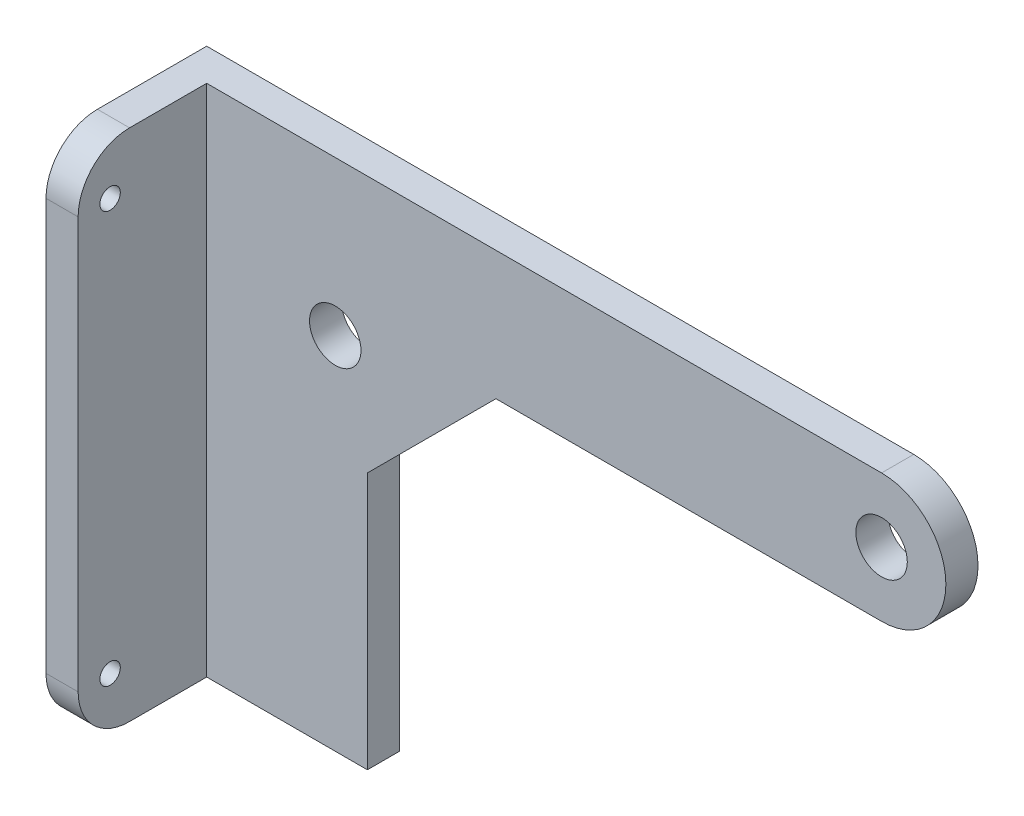
ISO-10303-21;
HEADER;
FILE_DESCRIPTION(('STEP AP214'),'2;1');
FILE_NAME('part.step','',(''),(''),'','','');
FILE_SCHEMA(('AUTOMOTIVE_DESIGN { 1 0 10303 214 1 1 1 1 }'));
ENDSEC;
DATA;
#1=APPLICATION_CONTEXT('core data for automotive mechanical design processes');
#2=APPLICATION_PROTOCOL_DEFINITION('international standard','automotive_design',2000,#1);
#3=PRODUCT_CONTEXT('',#1,'mechanical');
#4=PRODUCT('Part','Part','',(#3));
#5=PRODUCT_RELATED_PRODUCT_CATEGORY('part','',(#4));
#6=PRODUCT_DEFINITION_FORMATION('','',#4);
#7=PRODUCT_DEFINITION_CONTEXT('part definition',#1,'design');
#8=PRODUCT_DEFINITION('design','',#6,#7);
#9=PRODUCT_DEFINITION_SHAPE('','',#8);
#10=(LENGTH_UNIT() NAMED_UNIT(*) SI_UNIT(.MILLI.,.METRE.));
#11=(NAMED_UNIT(*) PLANE_ANGLE_UNIT() SI_UNIT($,.RADIAN.));
#12=(NAMED_UNIT(*) SI_UNIT($,.STERADIAN.) SOLID_ANGLE_UNIT());
#13=UNCERTAINTY_MEASURE_WITH_UNIT(LENGTH_MEASURE(1.E-05),#10,'distance_accuracy_value','');
#14=(GEOMETRIC_REPRESENTATION_CONTEXT(3) GLOBAL_UNCERTAINTY_ASSIGNED_CONTEXT((#13)) GLOBAL_UNIT_ASSIGNED_CONTEXT((#10,
#11,#12)) REPRESENTATION_CONTEXT('',''));
#15=CARTESIAN_POINT('',(0.,0.,0.));
#16=DIRECTION('',(0.,0.,1.));
#17=DIRECTION('',(1.,0.,0.));
#18=AXIS2_PLACEMENT_3D('',#15,#16,#17);
#19=CARTESIAN_POINT('',(405.,0.,12.5));
#20=DIRECTION('',(0.,0.,-1.));
#21=DIRECTION('',(-1.,0.,0.));
#22=AXIS2_PLACEMENT_3D('',#19,#20,#21);
#23=PLANE('',#22);
#24=CARTESIAN_POINT('',(-20.,-70.,12.5));
#25=DIRECTION('',(0.,0.,1.));
#26=DIRECTION('',(1.,0.,0.));
#27=AXIS2_PLACEMENT_3D('',#24,#25,#26);
#28=CIRCLE('',#27,20.);
#29=CARTESIAN_POINT('',(0.,-70.,12.5));
#30=VERTEX_POINT('',#29);
#31=EDGE_CURVE('E155',#30,#30,#28,.T.);
#32=ORIENTED_EDGE('',*,*,#31,.F.);
#33=EDGE_LOOP('',(#32));
#34=FACE_BOUND('',#33,.T.);
#35=CARTESIAN_POINT('',(405.,0.,12.5));
#36=DIRECTION('',(0.,0.,1.));
#37=DIRECTION('',(1.,0.,0.));
#38=AXIS2_PLACEMENT_3D('',#35,#36,#37);
#39=CIRCLE('',#38,20.);
#40=CARTESIAN_POINT('',(425.,0.,12.5));
#41=VERTEX_POINT('',#40);
#42=EDGE_CURVE('E161',#41,#41,#39,.T.);
#43=ORIENTED_EDGE('',*,*,#42,.F.);
#44=EDGE_LOOP('',(#43));
#45=FACE_BOUND('',#44,.T.);
#46=DIRECTION('',(0.,1.,0.));
#47=VECTOR('',#46,1.);
#48=CARTESIAN_POINT('',(-120.,-350.,12.5));
#49=LINE('',#48,#47);
#50=CARTESIAN_POINT('',(-120.,-350.,12.5));
#51=VERTEX_POINT('',#50);
#52=CARTESIAN_POINT('',(-120.,50.,12.5));
#53=VERTEX_POINT('',#52);
#54=EDGE_CURVE('E134',#51,#53,#49,.T.);
#55=ORIENTED_EDGE('',*,*,#54,.F.);
#56=DIRECTION('',(1.,0.,0.));
#57=VECTOR('',#56,1.);
#58=CARTESIAN_POINT('',(5.00000000000006,-350.,12.5));
#59=LINE('',#58,#57);
#60=CARTESIAN_POINT('',(5.00000000000006,-350.,12.5));
#61=VERTEX_POINT('',#60);
#62=EDGE_CURVE('E139',#51,#61,#59,.T.);
#63=ORIENTED_EDGE('',*,*,#62,.T.);
#64=DIRECTION('',(0.,1.,0.));
#65=VECTOR('',#64,1.);
#66=CARTESIAN_POINT('',(5.00000000000006,-150.,12.5));
#67=LINE('',#66,#65);
#68=CARTESIAN_POINT('',(5.00000000000006,-150.,12.5));
#69=VERTEX_POINT('',#68);
#70=EDGE_CURVE('E170',#61,#69,#67,.T.);
#71=ORIENTED_EDGE('',*,*,#70,.T.);
#72=DIRECTION('',(0.707106781186544,0.707106781186552,0.));
#73=VECTOR('',#72,1.);
#74=CARTESIAN_POINT('',(104.999999999999,-50.0000000000001,12.5));
#75=LINE('',#74,#73);
#76=CARTESIAN_POINT('',(104.999999999999,-50.0000000000001,12.5));
#77=VERTEX_POINT('',#76);
#78=EDGE_CURVE('E172',#69,#77,#75,.T.);
#79=ORIENTED_EDGE('',*,*,#78,.T.);
#80=DIRECTION('',(1.,0.,0.));
#81=VECTOR('',#80,1.);
#82=CARTESIAN_POINT('',(405.,-50.,12.5));
#83=LINE('',#82,#81);
#84=CARTESIAN_POINT('',(405.,-50.,12.5));
#85=VERTEX_POINT('',#84);
#86=EDGE_CURVE('E174',#77,#85,#83,.T.);
#87=ORIENTED_EDGE('',*,*,#86,.T.);
#88=CARTESIAN_POINT('',(405.,0.,12.5));
#89=DIRECTION('',(0.,0.,1.));
#90=DIRECTION('',(-1.,0.,0.));
#91=AXIS2_PLACEMENT_3D('',#88,#89,#90);
#92=CIRCLE('',#91,50.);
#93=CARTESIAN_POINT('',(405.,50.,12.5));
#94=VERTEX_POINT('',#93);
#95=EDGE_CURVE('E137',#85,#94,#92,.T.);
#96=ORIENTED_EDGE('',*,*,#95,.T.);
#97=DIRECTION('',(-1.,0.,0.));
#98=VECTOR('',#97,1.);
#99=CARTESIAN_POINT('',(-145.,50.,12.5));
#100=LINE('',#99,#98);
#101=EDGE_CURVE('E123',#94,#53,#100,.T.);
#102=ORIENTED_EDGE('',*,*,#101,.T.);
#103=EDGE_LOOP('',(#55,#63,#71,#79,#87,#96,#102));
#104=FACE_BOUND('',#103,.T.);
#105=ADVANCED_FACE('F37',(#34,#45,#104),#23,.F.);
#106=CARTESIAN_POINT('',(405.,0.,-12.5));
#107=DIRECTION('',(0.,0.,-1.));
#108=DIRECTION('',(-1.,0.,0.));
#109=AXIS2_PLACEMENT_3D('',#106,#107,#108);
#110=PLANE('',#109);
#111=CARTESIAN_POINT('',(405.,0.,-12.5));
#112=DIRECTION('',(0.,0.,1.));
#113=DIRECTION('',(1.,0.,0.));
#114=AXIS2_PLACEMENT_3D('',#111,#112,#113);
#115=CIRCLE('',#114,20.);
#116=CARTESIAN_POINT('',(425.,0.,-12.5));
#117=VERTEX_POINT('',#116);
#118=EDGE_CURVE('E158',#117,#117,#115,.T.);
#119=ORIENTED_EDGE('',*,*,#118,.T.);
#120=EDGE_LOOP('',(#119));
#121=FACE_BOUND('',#120,.T.);
#122=CARTESIAN_POINT('',(405.,0.,-12.5));
#123=DIRECTION('',(0.,0.,1.));
#124=DIRECTION('',(-1.,0.,0.));
#125=AXIS2_PLACEMENT_3D('',#122,#123,#124);
#126=CIRCLE('',#125,50.);
#127=CARTESIAN_POINT('',(405.,-50.,-12.5));
#128=VERTEX_POINT('',#127);
#129=CARTESIAN_POINT('',(405.,50.,-12.5));
#130=VERTEX_POINT('',#129);
#131=EDGE_CURVE('E164',#128,#130,#126,.T.);
#132=ORIENTED_EDGE('',*,*,#131,.F.);
#133=DIRECTION('',(1.,0.,0.));
#134=VECTOR('',#133,1.);
#135=CARTESIAN_POINT('',(405.,-50.,-12.5));
#136=LINE('',#135,#134);
#137=CARTESIAN_POINT('',(104.999999999999,-50.0000000000001,-12.5));
#138=VERTEX_POINT('',#137);
#139=EDGE_CURVE('E167',#138,#128,#136,.T.);
#140=ORIENTED_EDGE('',*,*,#139,.F.);
#141=DIRECTION('',(0.707106781186544,0.707106781186552,0.));
#142=VECTOR('',#141,1.);
#143=CARTESIAN_POINT('',(104.999999999999,-50.0000000000001,-12.5));
#144=LINE('',#143,#142);
#145=CARTESIAN_POINT('',(5.00000000000006,-150.,-12.5));
#146=VERTEX_POINT('',#145);
#147=EDGE_CURVE('E189',#146,#138,#144,.T.);
#148=ORIENTED_EDGE('',*,*,#147,.F.);
#149=DIRECTION('',(0.,1.,0.));
#150=VECTOR('',#149,1.);
#151=CARTESIAN_POINT('',(5.00000000000006,-150.,-12.5));
#152=LINE('',#151,#150);
#153=CARTESIAN_POINT('',(5.00000000000006,-350.,-12.5));
#154=VERTEX_POINT('',#153);
#155=EDGE_CURVE('E187',#154,#146,#152,.T.);
#156=ORIENTED_EDGE('',*,*,#155,.F.);
#157=DIRECTION('',(1.,0.,0.));
#158=VECTOR('',#157,1.);
#159=CARTESIAN_POINT('',(5.00000000000006,-350.,-12.5));
#160=LINE('',#159,#158);
#161=CARTESIAN_POINT('',(-145.,-350.,-12.5));
#162=VERTEX_POINT('',#161);
#163=EDGE_CURVE('E185',#162,#154,#160,.T.);
#164=ORIENTED_EDGE('',*,*,#163,.F.);
#165=DIRECTION('',(0.,-1.,0.));
#166=VECTOR('',#165,1.);
#167=CARTESIAN_POINT('',(-145.,-350.,-12.5));
#168=LINE('',#167,#166);
#169=CARTESIAN_POINT('',(-145.,50.,-12.5));
#170=VERTEX_POINT('',#169);
#171=EDGE_CURVE('E182',#170,#162,#168,.T.);
#172=ORIENTED_EDGE('',*,*,#171,.F.);
#173=DIRECTION('',(-1.,0.,0.));
#174=VECTOR('',#173,1.);
#175=CARTESIAN_POINT('',(-145.,50.,-12.5));
#176=LINE('',#175,#174);
#177=EDGE_CURVE('E179',#130,#170,#176,.T.);
#178=ORIENTED_EDGE('',*,*,#177,.F.);
#179=EDGE_LOOP('',(#132,#140,#148,#156,#164,#172,#178));
#180=FACE_BOUND('',#179,.T.);
#181=CARTESIAN_POINT('',(-20.,-70.,-12.5));
#182=DIRECTION('',(0.,0.,1.));
#183=DIRECTION('',(1.,0.,0.));
#184=AXIS2_PLACEMENT_3D('',#181,#182,#183);
#185=CIRCLE('',#184,20.);
#186=CARTESIAN_POINT('',(0.,-70.,-12.5));
#187=VERTEX_POINT('',#186);
#188=EDGE_CURVE('E154',#187,#187,#185,.T.);
#189=ORIENTED_EDGE('',*,*,#188,.T.);
#190=EDGE_LOOP('',(#189));
#191=FACE_BOUND('',#190,.T.);
#192=ADVANCED_FACE('F252',(#121,#180,#191),#110,.T.);
#193=CARTESIAN_POINT('',(405.,0.,12.5));
#194=DIRECTION('',(0.,0.,-1.));
#195=DIRECTION('',(-1.,0.,0.));
#196=AXIS2_PLACEMENT_3D('',#193,#194,#195);
#197=CYLINDRICAL_SURFACE('',#196,50.);
#198=ORIENTED_EDGE('',*,*,#131,.T.);
#199=DIRECTION('',(0.,0.,-1.));
#200=VECTOR('',#199,1.);
#201=CARTESIAN_POINT('',(405.,50.,12.5));
#202=LINE('',#201,#200);
#203=EDGE_CURVE('E207',#94,#130,#202,.T.);
#204=ORIENTED_EDGE('',*,*,#203,.F.);
#205=ORIENTED_EDGE('',*,*,#95,.F.);
#206=DIRECTION('',(0.,0.,-1.));
#207=VECTOR('',#206,1.);
#208=CARTESIAN_POINT('',(405.,-50.,12.5));
#209=LINE('',#208,#207);
#210=EDGE_CURVE('E176',#85,#128,#209,.T.);
#211=ORIENTED_EDGE('',*,*,#210,.T.);
#212=EDGE_LOOP('',(#198,#204,#205,#211));
#213=FACE_BOUND('',#212,.T.);
#214=ADVANCED_FACE('F248',(#213),#197,.T.);
#215=CARTESIAN_POINT('',(-145.,50.,12.5));
#216=DIRECTION('',(0.,-1.,0.));
#217=DIRECTION('',(1.,0.,0.));
#218=AXIS2_PLACEMENT_3D('',#215,#216,#217);
#219=PLANE('',#218);
#220=DIRECTION('',(0.,0.,-1.));
#221=VECTOR('',#220,1.);
#222=CARTESIAN_POINT('',(-145.,50.,12.5));
#223=LINE('',#222,#221);
#224=CARTESIAN_POINT('',(-145.,50.,72.5));
#225=VERTEX_POINT('',#224);
#226=EDGE_CURVE('E205',#225,#170,#223,.T.);
#227=ORIENTED_EDGE('',*,*,#226,.F.);
#228=DIRECTION('',(-1.,0.,0.));
#229=VECTOR('',#228,1.);
#230=CARTESIAN_POINT('',(-145.,50.,72.5));
#231=LINE('',#230,#229);
#232=CARTESIAN_POINT('',(-120.,50.,72.5));
#233=VERTEX_POINT('',#232);
#234=EDGE_CURVE('E11',#225,#233,#231,.F.);
#235=ORIENTED_EDGE('',*,*,#234,.T.);
#236=DIRECTION('',(0.,0.,-1.));
#237=VECTOR('',#236,1.);
#238=CARTESIAN_POINT('',(-120.,50.,112.5));
#239=LINE('',#238,#237);
#240=EDGE_CURVE('E119',#233,#53,#239,.T.);
#241=ORIENTED_EDGE('',*,*,#240,.T.);
#242=ORIENTED_EDGE('',*,*,#101,.F.);
#243=ORIENTED_EDGE('',*,*,#203,.T.);
#244=ORIENTED_EDGE('',*,*,#177,.T.);
#245=EDGE_LOOP('',(#227,#235,#241,#242,#243,#244));
#246=FACE_BOUND('',#245,.T.);
#247=ADVANCED_FACE('F121',(#246),#219,.F.);
#248=CARTESIAN_POINT('',(-145.,-350.,12.5));
#249=DIRECTION('',(1.,0.,0.));
#250=DIRECTION('',(0.,0.,-1.));
#251=AXIS2_PLACEMENT_3D('',#248,#249,#250);
#252=PLANE('',#251);
#253=CARTESIAN_POINT('',(-145.,9.99999999999997,87.6484096760624));
#254=DIRECTION('',(-1.,0.,0.));
#255=DIRECTION('',(0.,0.,1.));
#256=AXIS2_PLACEMENT_3D('',#253,#254,#255);
#257=CIRCLE('',#256,7.94);
#258=CARTESIAN_POINT('',(-145.,9.99999999999997,95.5884096760624));
#259=VERTEX_POINT('',#258);
#260=EDGE_CURVE('E149',#259,#259,#257,.T.);
#261=ORIENTED_EDGE('',*,*,#260,.F.);
#262=EDGE_LOOP('',(#261));
#263=FACE_BOUND('',#262,.T.);
#264=CARTESIAN_POINT('',(-145.,-310.,87.6484096760624));
#265=DIRECTION('',(-1.,0.,0.));
#266=DIRECTION('',(0.,0.,1.));
#267=AXIS2_PLACEMENT_3D('',#264,#265,#266);
#268=CIRCLE('',#267,7.94000000000001);
#269=CARTESIAN_POINT('',(-145.,-310.,95.5884096760624));
#270=VERTEX_POINT('',#269);
#271=EDGE_CURVE('E457',#270,#270,#268,.T.);
#272=ORIENTED_EDGE('',*,*,#271,.F.);
#273=EDGE_LOOP('',(#272));
#274=FACE_BOUND('',#273,.T.);
#275=DIRECTION('',(0.,0.,-1.));
#276=VECTOR('',#275,1.);
#277=CARTESIAN_POINT('',(-145.,-350.,12.5));
#278=LINE('',#277,#276);
#279=CARTESIAN_POINT('',(-145.,-350.,72.5));
#280=VERTEX_POINT('',#279);
#281=EDGE_CURVE('E203',#280,#162,#278,.T.);
#282=ORIENTED_EDGE('',*,*,#281,.F.);
#283=CARTESIAN_POINT('',(-145.,-310.,72.5));
#284=DIRECTION('',(1.,0.,0.));
#285=DIRECTION('',(0.,0.,-1.));
#286=AXIS2_PLACEMENT_3D('',#283,#284,#285);
#287=CIRCLE('',#286,40.);
#288=CARTESIAN_POINT('',(-145.,-310.,112.5));
#289=VERTEX_POINT('',#288);
#290=EDGE_CURVE('E45',#280,#289,#287,.F.);
#291=ORIENTED_EDGE('',*,*,#290,.T.);
#292=DIRECTION('',(0.,-1.,0.));
#293=VECTOR('',#292,1.);
#294=CARTESIAN_POINT('',(-145.,-350.,112.5));
#295=LINE('',#294,#293);
#296=CARTESIAN_POINT('',(-145.,10.,112.5));
#297=VERTEX_POINT('',#296);
#298=EDGE_CURVE('E143',#297,#289,#295,.T.);
#299=ORIENTED_EDGE('',*,*,#298,.F.);
#300=CARTESIAN_POINT('',(-145.,9.99999999999999,72.5));
#301=DIRECTION('',(1.,0.,0.));
#302=DIRECTION('',(0.,0.,-1.));
#303=AXIS2_PLACEMENT_3D('',#300,#301,#302);
#304=CIRCLE('',#303,40.);
#305=EDGE_CURVE('E52',#297,#225,#304,.F.);
#306=ORIENTED_EDGE('',*,*,#305,.T.);
#307=ORIENTED_EDGE('',*,*,#226,.T.);
#308=ORIENTED_EDGE('',*,*,#171,.T.);
#309=EDGE_LOOP('',(#282,#291,#299,#306,#307,#308));
#310=FACE_BOUND('',#309,.T.);
#311=ADVANCED_FACE('F221',(#263,#274,#310),#252,.F.);
#312=CARTESIAN_POINT('',(5.00000000000006,-350.,12.5));
#313=DIRECTION('',(0.,1.,0.));
#314=DIRECTION('',(-1.,0.,0.));
#315=AXIS2_PLACEMENT_3D('',#312,#313,#314);
#316=PLANE('',#315);
#317=DIRECTION('',(0.,0.,-1.));
#318=VECTOR('',#317,1.);
#319=CARTESIAN_POINT('',(-120.,-350.,112.5));
#320=LINE('',#319,#318);
#321=CARTESIAN_POINT('',(-120.,-350.,72.5));
#322=VERTEX_POINT('',#321);
#323=EDGE_CURVE('E129',#322,#51,#320,.T.);
#324=ORIENTED_EDGE('',*,*,#323,.F.);
#325=DIRECTION('',(1.,0.,0.));
#326=VECTOR('',#325,1.);
#327=CARTESIAN_POINT('',(5.00000000000006,-350.,72.5));
#328=LINE('',#327,#326);
#329=EDGE_CURVE('E60',#322,#280,#328,.F.);
#330=ORIENTED_EDGE('',*,*,#329,.T.);
#331=ORIENTED_EDGE('',*,*,#281,.T.);
#332=ORIENTED_EDGE('',*,*,#163,.T.);
#333=DIRECTION('',(0.,0.,-1.));
#334=VECTOR('',#333,1.);
#335=CARTESIAN_POINT('',(5.00000000000006,-350.,12.5));
#336=LINE('',#335,#334);
#337=EDGE_CURVE('E200',#61,#154,#336,.T.);
#338=ORIENTED_EDGE('',*,*,#337,.F.);
#339=ORIENTED_EDGE('',*,*,#62,.F.);
#340=EDGE_LOOP('',(#324,#330,#331,#332,#338,#339));
#341=FACE_BOUND('',#340,.T.);
#342=ADVANCED_FACE('F229',(#341),#316,.F.);
#343=CARTESIAN_POINT('',(5.00000000000006,-150.,12.5));
#344=DIRECTION('',(-1.,0.,0.));
#345=DIRECTION('',(0.,-1.,0.));
#346=AXIS2_PLACEMENT_3D('',#343,#344,#345);
#347=PLANE('',#346);
#348=ORIENTED_EDGE('',*,*,#155,.T.);
#349=DIRECTION('',(0.,0.,-1.));
#350=VECTOR('',#349,1.);
#351=CARTESIAN_POINT('',(5.00000000000006,-150.,12.5));
#352=LINE('',#351,#350);
#353=EDGE_CURVE('E197',#69,#146,#352,.T.);
#354=ORIENTED_EDGE('',*,*,#353,.F.);
#355=ORIENTED_EDGE('',*,*,#70,.F.);
#356=ORIENTED_EDGE('',*,*,#337,.T.);
#357=EDGE_LOOP('',(#348,#354,#355,#356));
#358=FACE_BOUND('',#357,.T.);
#359=ADVANCED_FACE('F236',(#358),#347,.F.);
#360=CARTESIAN_POINT('',(104.999999999999,-50.0000000000001,12.5));
#361=DIRECTION('',(-0.707106781186552,0.707106781186544,0.));
#362=DIRECTION('',(-0.707106781186544,-0.707106781186551,0.));
#363=AXIS2_PLACEMENT_3D('',#360,#361,#362);
#364=PLANE('',#363);
#365=ORIENTED_EDGE('',*,*,#147,.T.);
#366=DIRECTION('',(0.,0.,-1.));
#367=VECTOR('',#366,1.);
#368=CARTESIAN_POINT('',(104.999999999999,-50.0000000000001,12.5));
#369=LINE('',#368,#367);
#370=EDGE_CURVE('E194',#77,#138,#369,.T.);
#371=ORIENTED_EDGE('',*,*,#370,.F.);
#372=ORIENTED_EDGE('',*,*,#78,.F.);
#373=ORIENTED_EDGE('',*,*,#353,.T.);
#374=EDGE_LOOP('',(#365,#371,#372,#373));
#375=FACE_BOUND('',#374,.T.);
#376=ADVANCED_FACE('F240',(#375),#364,.F.);
#377=CARTESIAN_POINT('',(405.,-50.,12.5));
#378=DIRECTION('',(0.,1.,0.));
#379=DIRECTION('',(-1.,0.,0.));
#380=AXIS2_PLACEMENT_3D('',#377,#378,#379);
#381=PLANE('',#380);
#382=ORIENTED_EDGE('',*,*,#139,.T.);
#383=ORIENTED_EDGE('',*,*,#210,.F.);
#384=ORIENTED_EDGE('',*,*,#86,.F.);
#385=ORIENTED_EDGE('',*,*,#370,.T.);
#386=EDGE_LOOP('',(#382,#383,#384,#385));
#387=FACE_BOUND('',#386,.T.);
#388=ADVANCED_FACE('F245',(#387),#381,.F.);
#389=CARTESIAN_POINT('',(405.,0.,12.5));
#390=DIRECTION('',(0.,0.,-1.));
#391=DIRECTION('',(-1.,0.,0.));
#392=AXIS2_PLACEMENT_3D('',#389,#390,#391);
#393=CYLINDRICAL_SURFACE('',#392,20.);
#394=ORIENTED_EDGE('',*,*,#42,.T.);
#395=EDGE_LOOP('',(#394));
#396=FACE_BOUND('',#395,.T.);
#397=ORIENTED_EDGE('',*,*,#118,.F.);
#398=EDGE_LOOP('',(#397));
#399=FACE_BOUND('',#398,.T.);
#400=ADVANCED_FACE('F261',(#396,#399),#393,.F.);
#401=CARTESIAN_POINT('',(-20.,-70.,12.5));
#402=DIRECTION('',(0.,0.,-1.));
#403=DIRECTION('',(-1.,0.,0.));
#404=AXIS2_PLACEMENT_3D('',#401,#402,#403);
#405=CYLINDRICAL_SURFACE('',#404,20.);
#406=ORIENTED_EDGE('',*,*,#31,.T.);
#407=EDGE_LOOP('',(#406));
#408=FACE_BOUND('',#407,.T.);
#409=ORIENTED_EDGE('',*,*,#188,.F.);
#410=EDGE_LOOP('',(#409));
#411=FACE_BOUND('',#410,.T.);
#412=ADVANCED_FACE('F259',(#408,#411),#405,.F.);
#413=CARTESIAN_POINT('',(-120.,-350.,112.5));
#414=DIRECTION('',(-1.,0.,0.));
#415=DIRECTION('',(0.,-1.,0.));
#416=AXIS2_PLACEMENT_3D('',#413,#414,#415);
#417=PLANE('',#416);
#418=CARTESIAN_POINT('',(-120.,9.99999999999997,87.6484096760624));
#419=DIRECTION('',(-1.,0.,0.));
#420=DIRECTION('',(0.,-1.,0.));
#421=AXIS2_PLACEMENT_3D('',#418,#419,#420);
#422=CIRCLE('',#421,7.94);
#423=CARTESIAN_POINT('',(-120.,2.05999999999996,87.6484096760624));
#424=VERTEX_POINT('',#423);
#425=EDGE_CURVE('E144',#424,#424,#422,.F.);
#426=ORIENTED_EDGE('',*,*,#425,.F.);
#427=EDGE_LOOP('',(#426));
#428=FACE_BOUND('',#427,.T.);
#429=CARTESIAN_POINT('',(-120.,-310.,87.6484096760624));
#430=DIRECTION('',(-1.,0.,0.));
#431=DIRECTION('',(0.,-1.,0.));
#432=AXIS2_PLACEMENT_3D('',#429,#430,#431);
#433=CIRCLE('',#432,7.94000000000001);
#434=CARTESIAN_POINT('',(-120.,-317.94,87.6484096760624));
#435=VERTEX_POINT('',#434);
#436=EDGE_CURVE('E455',#435,#435,#433,.F.);
#437=ORIENTED_EDGE('',*,*,#436,.F.);
#438=EDGE_LOOP('',(#437));
#439=FACE_BOUND('',#438,.T.);
#440=DIRECTION('',(0.,1.,0.));
#441=VECTOR('',#440,1.);
#442=CARTESIAN_POINT('',(-120.,-350.,112.5));
#443=LINE('',#442,#441);
#444=CARTESIAN_POINT('',(-120.,-310.,112.5));
#445=VERTEX_POINT('',#444);
#446=CARTESIAN_POINT('',(-120.,10.,112.5));
#447=VERTEX_POINT('',#446);
#448=EDGE_CURVE('E130',#445,#447,#443,.T.);
#449=ORIENTED_EDGE('',*,*,#448,.F.);
#450=CARTESIAN_POINT('',(-120.,-310.,72.5));
#451=DIRECTION('',(-1.,0.,0.));
#452=DIRECTION('',(0.,-1.,0.));
#453=AXIS2_PLACEMENT_3D('',#450,#451,#452);
#454=CIRCLE('',#453,40.);
#455=EDGE_CURVE('E217',#445,#322,#454,.F.);
#456=ORIENTED_EDGE('',*,*,#455,.T.);
#457=ORIENTED_EDGE('',*,*,#323,.T.);
#458=ORIENTED_EDGE('',*,*,#54,.T.);
#459=ORIENTED_EDGE('',*,*,#240,.F.);
#460=CARTESIAN_POINT('',(-120.,9.99999999999999,72.5));
#461=DIRECTION('',(-1.,0.,0.));
#462=DIRECTION('',(0.,-1.,0.));
#463=AXIS2_PLACEMENT_3D('',#460,#461,#462);
#464=CIRCLE('',#463,40.);
#465=EDGE_CURVE('E215',#233,#447,#464,.F.);
#466=ORIENTED_EDGE('',*,*,#465,.T.);
#467=EDGE_LOOP('',(#449,#456,#457,#458,#459,#466));
#468=FACE_BOUND('',#467,.T.);
#469=ADVANCED_FACE('F142',(#428,#439,#468),#417,.F.);
#470=CARTESIAN_POINT('',(0.,0.,112.5));
#471=DIRECTION('',(0.,0.,-1.));
#472=DIRECTION('',(-1.,0.,0.));
#473=AXIS2_PLACEMENT_3D('',#470,#471,#472);
#474=PLANE('',#473);
#475=ORIENTED_EDGE('',*,*,#298,.T.);
#476=DIRECTION('',(1.,0.,0.));
#477=VECTOR('',#476,1.);
#478=CARTESIAN_POINT('',(1.14723045877933E-13,-310.,112.5));
#479=LINE('',#478,#477);
#480=EDGE_CURVE('E212',#289,#445,#479,.T.);
#481=ORIENTED_EDGE('',*,*,#480,.T.);
#482=ORIENTED_EDGE('',*,*,#448,.T.);
#483=DIRECTION('',(-1.,0.,0.));
#484=VECTOR('',#483,1.);
#485=CARTESIAN_POINT('',(0.,10.,112.5));
#486=LINE('',#485,#484);
#487=EDGE_CURVE('E209',#447,#297,#486,.T.);
#488=ORIENTED_EDGE('',*,*,#487,.T.);
#489=EDGE_LOOP('',(#475,#481,#482,#488));
#490=FACE_BOUND('',#489,.T.);
#491=ADVANCED_FACE('F225',(#490),#474,.F.);
#492=CARTESIAN_POINT('',(455.001,-310.,87.6484096760624));
#493=DIRECTION('',(-1.,0.,0.));
#494=DIRECTION('',(0.,0.,1.));
#495=AXIS2_PLACEMENT_3D('',#492,#493,#494);
#496=CYLINDRICAL_SURFACE('',#495,7.94000000000001);
#497=ORIENTED_EDGE('',*,*,#271,.T.);
#498=EDGE_LOOP('',(#497));
#499=FACE_BOUND('',#498,.T.);
#500=ORIENTED_EDGE('',*,*,#436,.T.);
#501=EDGE_LOOP('',(#500));
#502=FACE_BOUND('',#501,.T.);
#503=ADVANCED_FACE('F301',(#499,#502),#496,.F.);
#504=CARTESIAN_POINT('',(455.001,9.99999999999997,87.6484096760624));
#505=DIRECTION('',(-1.,0.,0.));
#506=DIRECTION('',(0.,0.,1.));
#507=AXIS2_PLACEMENT_3D('',#504,#505,#506);
#508=CYLINDRICAL_SURFACE('',#507,7.94);
#509=ORIENTED_EDGE('',*,*,#260,.T.);
#510=EDGE_LOOP('',(#509));
#511=FACE_BOUND('',#510,.T.);
#512=ORIENTED_EDGE('',*,*,#425,.T.);
#513=EDGE_LOOP('',(#512));
#514=FACE_BOUND('',#513,.T.);
#515=ADVANCED_FACE('F295',(#511,#514),#508,.F.);
#516=CARTESIAN_POINT('',(1.14723045877933E-13,-310.,72.5));
#517=DIRECTION('',(1.,0.,0.));
#518=DIRECTION('',(0.,1.,0.));
#519=AXIS2_PLACEMENT_3D('',#516,#517,#518);
#520=CYLINDRICAL_SURFACE('',#519,40.);
#521=ORIENTED_EDGE('',*,*,#290,.F.);
#522=ORIENTED_EDGE('',*,*,#329,.F.);
#523=ORIENTED_EDGE('',*,*,#455,.F.);
#524=ORIENTED_EDGE('',*,*,#480,.F.);
#525=EDGE_LOOP('',(#521,#522,#523,#524));
#526=FACE_BOUND('',#525,.T.);
#527=ADVANCED_FACE('F228',(#526),#520,.T.);
#528=CARTESIAN_POINT('',(0.,10.,72.5));
#529=DIRECTION('',(-1.,0.,0.));
#530=DIRECTION('',(0.,-1.,0.));
#531=AXIS2_PLACEMENT_3D('',#528,#529,#530);
#532=CYLINDRICAL_SURFACE('',#531,40.);
#533=ORIENTED_EDGE('',*,*,#465,.F.);
#534=ORIENTED_EDGE('',*,*,#234,.F.);
#535=ORIENTED_EDGE('',*,*,#305,.F.);
#536=ORIENTED_EDGE('',*,*,#487,.F.);
#537=EDGE_LOOP('',(#533,#534,#535,#536));
#538=FACE_BOUND('',#537,.T.);
#539=ADVANCED_FACE('F39',(#538),#532,.T.);
#540=CLOSED_SHELL('',(#105,#192,#214,#247,#311,#342,#359,#376,#388,#400,#412,#469,#491,#503,
#515,#527,#539));
#541=MANIFOLD_SOLID_BREP('B2',#540);
#542=ADVANCED_BREP_SHAPE_REPRESENTATION('',(#18,#541),#14);
#543=SHAPE_DEFINITION_REPRESENTATION(#9,#542);
ENDSEC;
END-ISO-10303-21;
